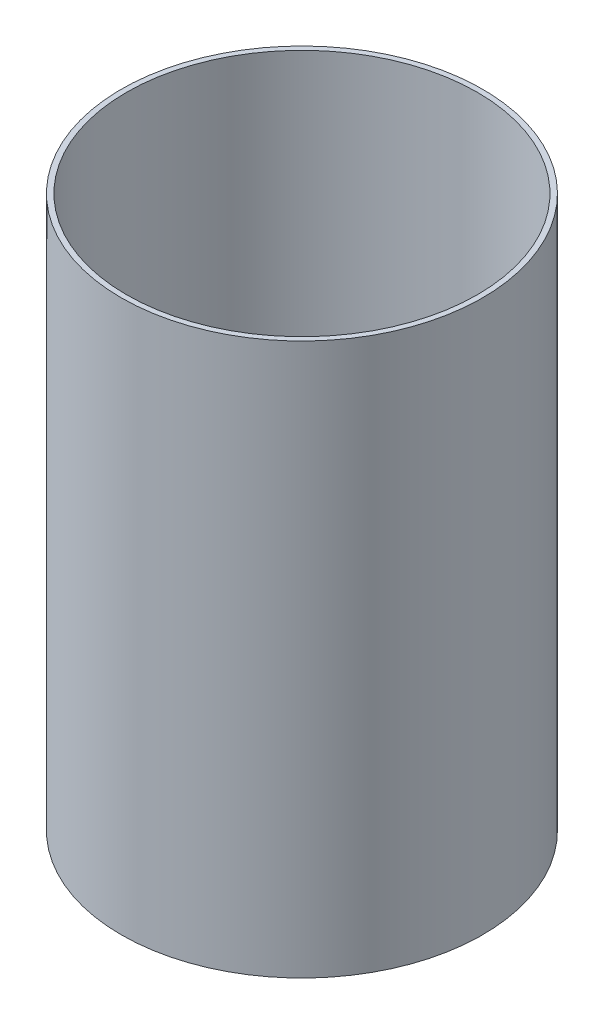
ISO-10303-21;
HEADER;
FILE_DESCRIPTION(('STEP AP214'),'2;1');
FILE_NAME('part.step','',(''),(''),'','','');
FILE_SCHEMA(('AUTOMOTIVE_DESIGN { 1 0 10303 214 1 1 1 1 }'));
ENDSEC;
DATA;
#1=APPLICATION_CONTEXT('core data for automotive mechanical design processes');
#2=APPLICATION_PROTOCOL_DEFINITION('international standard','automotive_design',2000,#1);
#3=PRODUCT_CONTEXT('',#1,'mechanical');
#4=PRODUCT('Part','Part','',(#3));
#5=PRODUCT_RELATED_PRODUCT_CATEGORY('part','',(#4));
#6=PRODUCT_DEFINITION_FORMATION('','',#4);
#7=PRODUCT_DEFINITION_CONTEXT('part definition',#1,'design');
#8=PRODUCT_DEFINITION('design','',#6,#7);
#9=PRODUCT_DEFINITION_SHAPE('','',#8);
#10=(LENGTH_UNIT() NAMED_UNIT(*) SI_UNIT(.MILLI.,.METRE.));
#11=(NAMED_UNIT(*) PLANE_ANGLE_UNIT() SI_UNIT($,.RADIAN.));
#12=(NAMED_UNIT(*) SI_UNIT($,.STERADIAN.) SOLID_ANGLE_UNIT());
#13=UNCERTAINTY_MEASURE_WITH_UNIT(LENGTH_MEASURE(1.E-05),#10,'distance_accuracy_value','');
#14=(GEOMETRIC_REPRESENTATION_CONTEXT(3) GLOBAL_UNCERTAINTY_ASSIGNED_CONTEXT((#13)) GLOBAL_UNIT_ASSIGNED_CONTEXT((#10,
#11,#12)) REPRESENTATION_CONTEXT('',''));
#15=CARTESIAN_POINT('',(0.,0.,0.));
#16=DIRECTION('',(0.,0.,1.));
#17=DIRECTION('',(1.,0.,0.));
#18=AXIS2_PLACEMENT_3D('',#15,#16,#17);
#19=CARTESIAN_POINT('',(0.,120.,0.));
#20=DIRECTION('',(0.,1.,0.));
#21=DIRECTION('',(0.,0.,1.));
#22=AXIS2_PLACEMENT_3D('',#19,#20,#21);
#23=PLANE('',#22);
#24=CARTESIAN_POINT('',(0.,120.,0.));
#25=DIRECTION('',(0.,1.,0.));
#26=DIRECTION('',(0.,0.,1.));
#27=AXIS2_PLACEMENT_3D('',#24,#25,#26);
#28=CIRCLE('',#27,39.3);
#29=CARTESIAN_POINT('',(0.,120.,39.3));
#30=VERTEX_POINT('',#29);
#31=EDGE_CURVE('E10',#30,#30,#28,.T.);
#32=ORIENTED_EDGE('',*,*,#31,.T.);
#33=EDGE_LOOP('',(#32));
#34=FACE_BOUND('',#33,.T.);
#35=CARTESIAN_POINT('',(0.,120.,0.));
#36=DIRECTION('',(0.,1.,0.));
#37=DIRECTION('',(0.,0.,1.));
#38=AXIS2_PLACEMENT_3D('',#35,#36,#37);
#39=CIRCLE('',#38,38.15);
#40=CARTESIAN_POINT('',(0.,120.,38.15));
#41=VERTEX_POINT('',#40);
#42=EDGE_CURVE('E54',#41,#41,#39,.T.);
#43=ORIENTED_EDGE('',*,*,#42,.F.);
#44=EDGE_LOOP('',(#43));
#45=FACE_BOUND('',#44,.T.);
#46=ADVANCED_FACE('F43',(#34,#45),#23,.T.);
#47=CARTESIAN_POINT('',(0.,0.,0.));
#48=DIRECTION('',(0.,1.,0.));
#49=DIRECTION('',(0.,0.,1.));
#50=AXIS2_PLACEMENT_3D('',#47,#48,#49);
#51=PLANE('',#50);
#52=CARTESIAN_POINT('',(0.,0.,0.));
#53=DIRECTION('',(0.,1.,0.));
#54=DIRECTION('',(0.,0.,1.));
#55=AXIS2_PLACEMENT_3D('',#52,#53,#54);
#56=CIRCLE('',#55,39.3);
#57=CARTESIAN_POINT('',(0.,0.,39.3));
#58=VERTEX_POINT('',#57);
#59=EDGE_CURVE('E47',#58,#58,#56,.T.);
#60=ORIENTED_EDGE('',*,*,#59,.F.);
#61=EDGE_LOOP('',(#60));
#62=FACE_BOUND('',#61,.T.);
#63=CARTESIAN_POINT('',(0.,0.,0.));
#64=DIRECTION('',(0.,1.,0.));
#65=DIRECTION('',(0.,0.,1.));
#66=AXIS2_PLACEMENT_3D('',#63,#64,#65);
#67=CIRCLE('',#66,38.15);
#68=CARTESIAN_POINT('',(0.,0.,38.15));
#69=VERTEX_POINT('',#68);
#70=EDGE_CURVE('E56',#69,#69,#67,.T.);
#71=ORIENTED_EDGE('',*,*,#70,.T.);
#72=EDGE_LOOP('',(#71));
#73=FACE_BOUND('',#72,.T.);
#74=ADVANCED_FACE('F66',(#62,#73),#51,.F.);
#75=CARTESIAN_POINT('',(0.,120.,0.));
#76=DIRECTION('',(0.,-1.,0.));
#77=DIRECTION('',(0.,0.,-1.));
#78=AXIS2_PLACEMENT_3D('',#75,#76,#77);
#79=CYLINDRICAL_SURFACE('',#78,39.3);
#80=ORIENTED_EDGE('',*,*,#31,.F.);
#81=EDGE_LOOP('',(#80));
#82=FACE_BOUND('',#81,.T.);
#83=ORIENTED_EDGE('',*,*,#59,.T.);
#84=EDGE_LOOP('',(#83));
#85=FACE_BOUND('',#84,.T.);
#86=ADVANCED_FACE('F45',(#82,#85),#79,.T.);
#87=CARTESIAN_POINT('',(0.,120.,0.));
#88=DIRECTION('',(0.,-1.,0.));
#89=DIRECTION('',(0.,0.,-1.));
#90=AXIS2_PLACEMENT_3D('',#87,#88,#89);
#91=CYLINDRICAL_SURFACE('',#90,38.15);
#92=ORIENTED_EDGE('',*,*,#42,.T.);
#93=EDGE_LOOP('',(#92));
#94=FACE_BOUND('',#93,.T.);
#95=ORIENTED_EDGE('',*,*,#70,.F.);
#96=EDGE_LOOP('',(#95));
#97=FACE_BOUND('',#96,.T.);
#98=ADVANCED_FACE('F62',(#94,#97),#91,.F.);
#99=CLOSED_SHELL('',(#46,#74,#86,#98));
#100=MANIFOLD_SOLID_BREP('B2',#99);
#101=ADVANCED_BREP_SHAPE_REPRESENTATION('',(#18,#100),#14);
#102=SHAPE_DEFINITION_REPRESENTATION(#9,#101);
ENDSEC;
END-ISO-10303-21;
